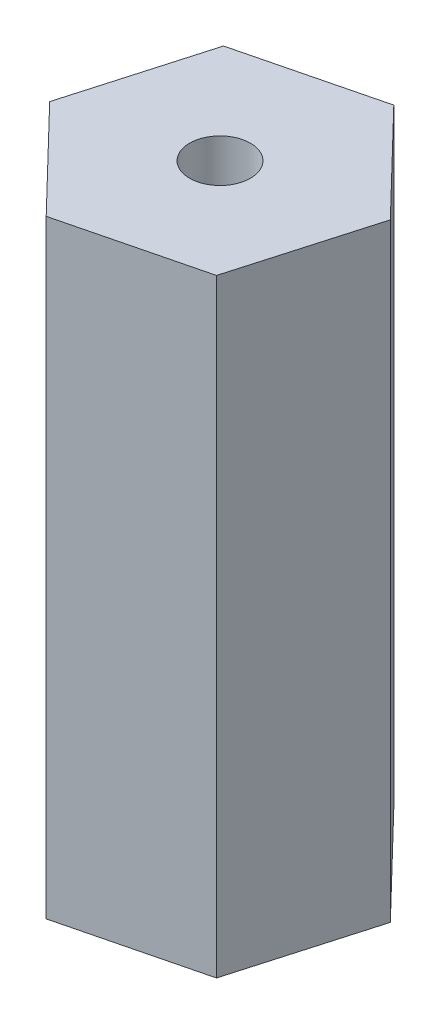
ISO-10303-21;
HEADER;
FILE_DESCRIPTION(('STEP AP214'),'2;1');
FILE_NAME('part.step','',(''),(''),'','','');
FILE_SCHEMA(('AUTOMOTIVE_DESIGN { 1 0 10303 214 1 1 1 1 }'));
ENDSEC;
DATA;
#1=APPLICATION_CONTEXT('core data for automotive mechanical design processes');
#2=APPLICATION_PROTOCOL_DEFINITION('international standard','automotive_design',2000,#1);
#3=PRODUCT_CONTEXT('',#1,'mechanical');
#4=PRODUCT('Part','Part','',(#3));
#5=PRODUCT_RELATED_PRODUCT_CATEGORY('part','',(#4));
#6=PRODUCT_DEFINITION_FORMATION('','',#4);
#7=PRODUCT_DEFINITION_CONTEXT('part definition',#1,'design');
#8=PRODUCT_DEFINITION('design','',#6,#7);
#9=PRODUCT_DEFINITION_SHAPE('','',#8);
#10=(LENGTH_UNIT() NAMED_UNIT(*) SI_UNIT(.MILLI.,.METRE.));
#11=(NAMED_UNIT(*) PLANE_ANGLE_UNIT() SI_UNIT($,.RADIAN.));
#12=(NAMED_UNIT(*) SI_UNIT($,.STERADIAN.) SOLID_ANGLE_UNIT());
#13=UNCERTAINTY_MEASURE_WITH_UNIT(LENGTH_MEASURE(1.E-05),#10,'distance_accuracy_value','');
#14=(GEOMETRIC_REPRESENTATION_CONTEXT(3) GLOBAL_UNCERTAINTY_ASSIGNED_CONTEXT((#13)) GLOBAL_UNIT_ASSIGNED_CONTEXT((#10,
#11,#12)) REPRESENTATION_CONTEXT('',''));
#15=CARTESIAN_POINT('',(0.,0.,0.));
#16=DIRECTION('',(0.,0.,1.));
#17=DIRECTION('',(1.,0.,0.));
#18=AXIS2_PLACEMENT_3D('',#15,#16,#17);
#19=CARTESIAN_POINT('',(-1.91026278693189,30.,6.65964684385465));
#20=DIRECTION('',(-0.241835763884429,0.,-0.970317197264088));
#21=DIRECTION('',(-0.970317197264088,0.,0.241835763884429));
#22=AXIS2_PLACEMENT_3D('',#19,#20,#21);
#23=PLANE('',#22);
#24=DIRECTION('',(0.970317197264088,0.,-0.241835763884429));
#25=VECTOR('',#24,1.);
#26=CARTESIAN_POINT('',(-1.91026278693189,0.,6.65964684385465));
#27=LINE('',#26,#25);
#28=CARTESIAN_POINT('',(-1.91026278693189,0.,6.65964684385465));
#29=VERTEX_POINT('',#28);
#30=CARTESIAN_POINT('',(4.81229195354504,0.,4.9841595233144));
#31=VERTEX_POINT('',#30);
#32=EDGE_CURVE('E117',#29,#31,#27,.T.);
#33=ORIENTED_EDGE('',*,*,#32,.T.);
#34=DIRECTION('',(0.,-1.,0.));
#35=VECTOR('',#34,1.);
#36=CARTESIAN_POINT('',(4.81229195354504,30.,4.9841595233144));
#37=LINE('',#36,#35);
#38=CARTESIAN_POINT('',(4.81229195354504,30.,4.9841595233144));
#39=VERTEX_POINT('',#38);
#40=EDGE_CURVE('E11',#39,#31,#37,.T.);
#41=ORIENTED_EDGE('',*,*,#40,.F.);
#42=DIRECTION('',(0.970317197264088,0.,-0.241835763884429));
#43=VECTOR('',#42,1.);
#44=CARTESIAN_POINT('',(-1.91026278693189,30.,6.65964684385465));
#45=LINE('',#44,#43);
#46=CARTESIAN_POINT('',(-1.91026278693189,30.,6.65964684385465));
#47=VERTEX_POINT('',#46);
#48=EDGE_CURVE('E128',#47,#39,#45,.T.);
#49=ORIENTED_EDGE('',*,*,#48,.F.);
#50=DIRECTION('',(0.,-1.,0.));
#51=VECTOR('',#50,1.);
#52=CARTESIAN_POINT('',(-1.91026278693189,30.,6.65964684385465));
#53=LINE('',#52,#51);
#54=EDGE_CURVE('E113',#47,#29,#53,.T.);
#55=ORIENTED_EDGE('',*,*,#54,.T.);
#56=EDGE_LOOP('',(#33,#41,#49,#55));
#57=FACE_BOUND('',#56,.T.);
#58=ADVANCED_FACE('F33',(#57),#23,.F.);
#59=CARTESIAN_POINT('',(4.81229195354504,30.,4.9841595233144));
#60=DIRECTION('',(-0.961237224501831,0.,-0.275722683564513));
#61=DIRECTION('',(-0.275722683564513,0.,0.961237224501831));
#62=AXIS2_PLACEMENT_3D('',#59,#60,#61);
#63=PLANE('',#62);
#64=DIRECTION('',(0.275722683564513,0.,-0.961237224501831));
#65=VECTOR('',#64,1.);
#66=CARTESIAN_POINT('',(4.81229195354504,0.,4.9841595233144));
#67=LINE('',#66,#65);
#68=CARTESIAN_POINT('',(6.72255474047693,0.,-1.67548732054025));
#69=VERTEX_POINT('',#68);
#70=EDGE_CURVE('E120',#31,#69,#67,.T.);
#71=ORIENTED_EDGE('',*,*,#70,.T.);
#72=DIRECTION('',(0.,-1.,0.));
#73=VECTOR('',#72,1.);
#74=CARTESIAN_POINT('',(6.72255474047693,30.,-1.67548732054025));
#75=LINE('',#74,#73);
#76=CARTESIAN_POINT('',(6.72255474047693,30.,-1.67548732054025));
#77=VERTEX_POINT('',#76);
#78=EDGE_CURVE('E41',#77,#69,#75,.T.);
#79=ORIENTED_EDGE('',*,*,#78,.F.);
#80=DIRECTION('',(0.275722683564513,0.,-0.961237224501831));
#81=VECTOR('',#80,1.);
#82=CARTESIAN_POINT('',(4.81229195354504,30.,4.9841595233144));
#83=LINE('',#82,#81);
#84=EDGE_CURVE('E86',#39,#77,#83,.T.);
#85=ORIENTED_EDGE('',*,*,#84,.F.);
#86=ORIENTED_EDGE('',*,*,#40,.T.);
#87=EDGE_LOOP('',(#71,#79,#85,#86));
#88=FACE_BOUND('',#87,.T.);
#89=ADVANCED_FACE('F153',(#88),#63,.F.);
#90=CARTESIAN_POINT('',(6.72255474047693,30.,-1.67548732054025));
#91=DIRECTION('',(-0.719401460617402,0.,0.694594513699575));
#92=DIRECTION('',(0.694594513699575,0.,0.719401460617402));
#93=AXIS2_PLACEMENT_3D('',#90,#91,#92);
#94=PLANE('',#93);
#95=DIRECTION('',(-0.694594513699575,0.,-0.719401460617402));
#96=VECTOR('',#95,1.);
#97=CARTESIAN_POINT('',(6.72255474047693,0.,-1.67548732054025));
#98=LINE('',#97,#96);
#99=CARTESIAN_POINT('',(1.91026278693189,0.,-6.65964684385465));
#100=VERTEX_POINT('',#99);
#101=EDGE_CURVE('E123',#69,#100,#98,.T.);
#102=ORIENTED_EDGE('',*,*,#101,.T.);
#103=DIRECTION('',(0.,-1.,0.));
#104=VECTOR('',#103,1.);
#105=CARTESIAN_POINT('',(1.91026278693189,30.,-6.65964684385465));
#106=LINE('',#105,#104);
#107=CARTESIAN_POINT('',(1.91026278693189,30.,-6.65964684385465));
#108=VERTEX_POINT('',#107);
#109=EDGE_CURVE('E108',#108,#100,#106,.T.);
#110=ORIENTED_EDGE('',*,*,#109,.F.);
#111=DIRECTION('',(-0.694594513699575,0.,-0.719401460617402));
#112=VECTOR('',#111,1.);
#113=CARTESIAN_POINT('',(6.72255474047693,30.,-1.67548732054025));
#114=LINE('',#113,#112);
#115=EDGE_CURVE('E99',#77,#108,#114,.T.);
#116=ORIENTED_EDGE('',*,*,#115,.F.);
#117=ORIENTED_EDGE('',*,*,#78,.T.);
#118=EDGE_LOOP('',(#102,#110,#116,#117));
#119=FACE_BOUND('',#118,.T.);
#120=ADVANCED_FACE('F134',(#119),#94,.F.);
#121=CARTESIAN_POINT('',(1.91026278693189,30.,-6.65964684385465));
#122=DIRECTION('',(0.241835763884429,0.,0.970317197264088));
#123=DIRECTION('',(0.970317197264088,0.,-0.241835763884429));
#124=AXIS2_PLACEMENT_3D('',#121,#122,#123);
#125=PLANE('',#124);
#126=DIRECTION('',(-0.970317197264088,0.,0.241835763884429));
#127=VECTOR('',#126,1.);
#128=CARTESIAN_POINT('',(1.91026278693189,0.,-6.65964684385465));
#129=LINE('',#128,#127);
#130=CARTESIAN_POINT('',(-4.81229195354504,0.,-4.9841595233144));
#131=VERTEX_POINT('',#130);
#132=EDGE_CURVE('E107',#100,#131,#129,.T.);
#133=ORIENTED_EDGE('',*,*,#132,.T.);
#134=DIRECTION('',(0.,-1.,0.));
#135=VECTOR('',#134,1.);
#136=CARTESIAN_POINT('',(-4.81229195354504,30.,-4.9841595233144));
#137=LINE('',#136,#135);
#138=CARTESIAN_POINT('',(-4.81229195354504,30.,-4.9841595233144));
#139=VERTEX_POINT('',#138);
#140=EDGE_CURVE('E104',#139,#131,#137,.T.);
#141=ORIENTED_EDGE('',*,*,#140,.F.);
#142=DIRECTION('',(-0.970317197264088,0.,0.241835763884429));
#143=VECTOR('',#142,1.);
#144=CARTESIAN_POINT('',(1.91026278693189,30.,-6.65964684385465));
#145=LINE('',#144,#143);
#146=EDGE_CURVE('E93',#108,#139,#145,.T.);
#147=ORIENTED_EDGE('',*,*,#146,.F.);
#148=ORIENTED_EDGE('',*,*,#109,.T.);
#149=EDGE_LOOP('',(#133,#141,#147,#148));
#150=FACE_BOUND('',#149,.T.);
#151=ADVANCED_FACE('F105',(#150),#125,.F.);
#152=CARTESIAN_POINT('',(-4.81229195354504,30.,-4.9841595233144));
#153=DIRECTION('',(0.961237224501831,0.,0.275722683564513));
#154=DIRECTION('',(0.275722683564513,0.,-0.961237224501831));
#155=AXIS2_PLACEMENT_3D('',#152,#153,#154);
#156=PLANE('',#155);
#157=DIRECTION('',(-0.275722683564513,0.,0.961237224501831));
#158=VECTOR('',#157,1.);
#159=CARTESIAN_POINT('',(-4.81229195354504,0.,-4.9841595233144));
#160=LINE('',#159,#158);
#161=CARTESIAN_POINT('',(-6.72255474047693,0.,1.67548732054025));
#162=VERTEX_POINT('',#161);
#163=EDGE_CURVE('E72',#131,#162,#160,.T.);
#164=ORIENTED_EDGE('',*,*,#163,.T.);
#165=DIRECTION('',(0.,-1.,0.));
#166=VECTOR('',#165,1.);
#167=CARTESIAN_POINT('',(-6.72255474047693,30.,1.67548732054025));
#168=LINE('',#167,#166);
#169=CARTESIAN_POINT('',(-6.72255474047693,30.,1.67548732054025));
#170=VERTEX_POINT('',#169);
#171=EDGE_CURVE('E109',#170,#162,#168,.T.);
#172=ORIENTED_EDGE('',*,*,#171,.F.);
#173=DIRECTION('',(-0.275722683564513,0.,0.961237224501831));
#174=VECTOR('',#173,1.);
#175=CARTESIAN_POINT('',(-4.81229195354504,30.,-4.9841595233144));
#176=LINE('',#175,#174);
#177=EDGE_CURVE('E97',#139,#170,#176,.T.);
#178=ORIENTED_EDGE('',*,*,#177,.F.);
#179=ORIENTED_EDGE('',*,*,#140,.T.);
#180=EDGE_LOOP('',(#164,#172,#178,#179));
#181=FACE_BOUND('',#180,.T.);
#182=ADVANCED_FACE('F111',(#181),#156,.F.);
#183=CARTESIAN_POINT('',(-6.72255474047693,30.,1.67548732054025));
#184=DIRECTION('',(0.719401460617402,0.,-0.694594513699575));
#185=DIRECTION('',(-0.694594513699575,0.,-0.719401460617402));
#186=AXIS2_PLACEMENT_3D('',#183,#184,#185);
#187=PLANE('',#186);
#188=DIRECTION('',(0.694594513699575,0.,0.719401460617402));
#189=VECTOR('',#188,1.);
#190=CARTESIAN_POINT('',(-6.72255474047693,0.,1.67548732054025));
#191=LINE('',#190,#189);
#192=EDGE_CURVE('E78',#162,#29,#191,.T.);
#193=ORIENTED_EDGE('',*,*,#192,.T.);
#194=ORIENTED_EDGE('',*,*,#54,.F.);
#195=DIRECTION('',(0.694594513699575,0.,0.719401460617402));
#196=VECTOR('',#195,1.);
#197=CARTESIAN_POINT('',(-6.72255474047693,30.,1.67548732054025));
#198=LINE('',#197,#196);
#199=EDGE_CURVE('E49',#170,#47,#198,.T.);
#200=ORIENTED_EDGE('',*,*,#199,.F.);
#201=ORIENTED_EDGE('',*,*,#171,.T.);
#202=EDGE_LOOP('',(#193,#194,#200,#201));
#203=FACE_BOUND('',#202,.T.);
#204=ADVANCED_FACE('F141',(#203),#187,.F.);
#205=CARTESIAN_POINT('',(0.,30.,0.));
#206=DIRECTION('',(0.,1.,0.));
#207=DIRECTION('',(0.,0.,1.));
#208=AXIS2_PLACEMENT_3D('',#205,#206,#207);
#209=PLANE('',#208);
#210=CARTESIAN_POINT('',(0.,30.,0.));
#211=DIRECTION('',(0.,-1.,0.));
#212=DIRECTION('',(0.,0.,-1.));
#213=AXIS2_PLACEMENT_3D('',#210,#211,#212);
#214=CIRCLE('',#213,1.5);
#215=CARTESIAN_POINT('',(0.,30.,-1.5));
#216=VERTEX_POINT('',#215);
#217=EDGE_CURVE('E121',#216,#216,#214,.T.);
#218=ORIENTED_EDGE('',*,*,#217,.T.);
#219=EDGE_LOOP('',(#218));
#220=FACE_BOUND('',#219,.T.);
#221=ORIENTED_EDGE('',*,*,#48,.T.);
#222=ORIENTED_EDGE('',*,*,#84,.T.);
#223=ORIENTED_EDGE('',*,*,#115,.T.);
#224=ORIENTED_EDGE('',*,*,#146,.T.);
#225=ORIENTED_EDGE('',*,*,#177,.T.);
#226=ORIENTED_EDGE('',*,*,#199,.T.);
#227=EDGE_LOOP('',(#221,#222,#223,#224,#225,#226));
#228=FACE_BOUND('',#227,.T.);
#229=ADVANCED_FACE('F95',(#220,#228),#209,.T.);
#230=CARTESIAN_POINT('',(0.,0.,0.));
#231=DIRECTION('',(0.,1.,0.));
#232=DIRECTION('',(0.,0.,1.));
#233=AXIS2_PLACEMENT_3D('',#230,#231,#232);
#234=PLANE('',#233);
#235=CARTESIAN_POINT('',(0.,0.,0.));
#236=DIRECTION('',(0.,-1.,0.));
#237=DIRECTION('',(0.,0.,-1.));
#238=AXIS2_PLACEMENT_3D('',#235,#236,#237);
#239=CIRCLE('',#238,1.5);
#240=CARTESIAN_POINT('',(0.,0.,-1.5));
#241=VERTEX_POINT('',#240);
#242=EDGE_CURVE('E208',#241,#241,#239,.T.);
#243=ORIENTED_EDGE('',*,*,#242,.F.);
#244=EDGE_LOOP('',(#243));
#245=FACE_BOUND('',#244,.T.);
#246=ORIENTED_EDGE('',*,*,#32,.F.);
#247=ORIENTED_EDGE('',*,*,#192,.F.);
#248=ORIENTED_EDGE('',*,*,#163,.F.);
#249=ORIENTED_EDGE('',*,*,#132,.F.);
#250=ORIENTED_EDGE('',*,*,#101,.F.);
#251=ORIENTED_EDGE('',*,*,#70,.F.);
#252=EDGE_LOOP('',(#246,#247,#248,#249,#250,#251));
#253=FACE_BOUND('',#252,.T.);
#254=ADVANCED_FACE('F137',(#245,#253),#234,.F.);
#255=CARTESIAN_POINT('',(0.,30.,0.));
#256=DIRECTION('',(0.,-1.,0.));
#257=DIRECTION('',(0.,0.,-1.));
#258=AXIS2_PLACEMENT_3D('',#255,#256,#257);
#259=CYLINDRICAL_SURFACE('',#258,1.5);
#260=ORIENTED_EDGE('',*,*,#217,.F.);
#261=EDGE_LOOP('',(#260));
#262=FACE_BOUND('',#261,.T.);
#263=ORIENTED_EDGE('',*,*,#242,.T.);
#264=EDGE_LOOP('',(#263));
#265=FACE_BOUND('',#264,.T.);
#266=ADVANCED_FACE('F190',(#262,#265),#259,.F.);
#267=CLOSED_SHELL('',(#58,#89,#120,#151,#182,#204,#229,#254,#266));
#268=MANIFOLD_SOLID_BREP('B2',#267);
#269=ADVANCED_BREP_SHAPE_REPRESENTATION('',(#18,#268),#14);
#270=SHAPE_DEFINITION_REPRESENTATION(#9,#269);
ENDSEC;
END-ISO-10303-21;
